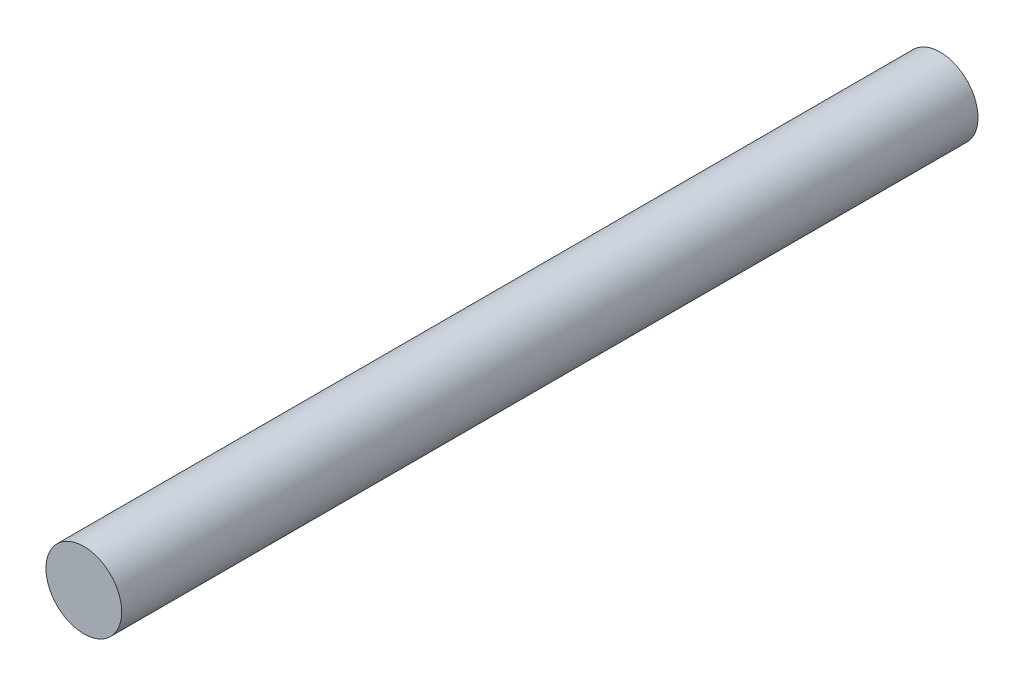
ISO-10303-21;
HEADER;
FILE_DESCRIPTION(('STEP AP214'),'2;1');
FILE_NAME('part.step','',(''),(''),'','','');
FILE_SCHEMA(('AUTOMOTIVE_DESIGN { 1 0 10303 214 1 1 1 1 }'));
ENDSEC;
DATA;
#1=APPLICATION_CONTEXT('core data for automotive mechanical design processes');
#2=APPLICATION_PROTOCOL_DEFINITION('international standard','automotive_design',2000,#1);
#3=PRODUCT_CONTEXT('',#1,'mechanical');
#4=PRODUCT('Part','Part','',(#3));
#5=PRODUCT_RELATED_PRODUCT_CATEGORY('part','',(#4));
#6=PRODUCT_DEFINITION_FORMATION('','',#4);
#7=PRODUCT_DEFINITION_CONTEXT('part definition',#1,'design');
#8=PRODUCT_DEFINITION('design','',#6,#7);
#9=PRODUCT_DEFINITION_SHAPE('','',#8);
#10=(LENGTH_UNIT() NAMED_UNIT(*) SI_UNIT(.MILLI.,.METRE.));
#11=(NAMED_UNIT(*) PLANE_ANGLE_UNIT() SI_UNIT($,.RADIAN.));
#12=(NAMED_UNIT(*) SI_UNIT($,.STERADIAN.) SOLID_ANGLE_UNIT());
#13=UNCERTAINTY_MEASURE_WITH_UNIT(LENGTH_MEASURE(1.E-05),#10,'distance_accuracy_value','');
#14=(GEOMETRIC_REPRESENTATION_CONTEXT(3) GLOBAL_UNCERTAINTY_ASSIGNED_CONTEXT((#13)) GLOBAL_UNIT_ASSIGNED_CONTEXT((#10,
#11,#12)) REPRESENTATION_CONTEXT('',''));
#15=CARTESIAN_POINT('',(0.,0.,0.));
#16=DIRECTION('',(0.,0.,1.));
#17=DIRECTION('',(1.,0.,0.));
#18=AXIS2_PLACEMENT_3D('',#15,#16,#17);
#19=CARTESIAN_POINT('',(0.,0.,71.7296));
#20=DIRECTION('',(0.,0.,-1.));
#21=DIRECTION('',(-1.,0.,0.));
#22=AXIS2_PLACEMENT_3D('',#19,#20,#21);
#23=CYLINDRICAL_SURFACE('',#22,3.175);
#24=CARTESIAN_POINT('',(0.,0.,71.7296));
#25=DIRECTION('',(0.,0.,1.));
#26=DIRECTION('',(1.,0.,0.));
#27=AXIS2_PLACEMENT_3D('',#24,#25,#26);
#28=CIRCLE('',#27,3.175);
#29=CARTESIAN_POINT('',(3.175,0.,71.7296));
#30=VERTEX_POINT('',#29);
#31=EDGE_CURVE('E10',#30,#30,#28,.T.);
#32=ORIENTED_EDGE('',*,*,#31,.F.);
#33=EDGE_LOOP('',(#32));
#34=FACE_BOUND('',#33,.T.);
#35=CARTESIAN_POINT('',(0.,0.,0.));
#36=DIRECTION('',(0.,0.,1.));
#37=DIRECTION('',(1.,0.,0.));
#38=AXIS2_PLACEMENT_3D('',#35,#36,#37);
#39=CIRCLE('',#38,3.175);
#40=CARTESIAN_POINT('',(3.175,0.,0.));
#41=VERTEX_POINT('',#40);
#42=EDGE_CURVE('E36',#41,#41,#39,.T.);
#43=ORIENTED_EDGE('',*,*,#42,.T.);
#44=EDGE_LOOP('',(#43));
#45=FACE_BOUND('',#44,.T.);
#46=ADVANCED_FACE('F33',(#34,#45),#23,.T.);
#47=CARTESIAN_POINT('',(0.,0.,71.7296));
#48=DIRECTION('',(0.,0.,1.));
#49=DIRECTION('',(1.,0.,0.));
#50=AXIS2_PLACEMENT_3D('',#47,#48,#49);
#51=PLANE('',#50);
#52=ORIENTED_EDGE('',*,*,#31,.T.);
#53=EDGE_LOOP('',(#52));
#54=FACE_BOUND('',#53,.T.);
#55=ADVANCED_FACE('F48',(#54),#51,.T.);
#56=CARTESIAN_POINT('',(0.,0.,0.));
#57=DIRECTION('',(0.,0.,1.));
#58=DIRECTION('',(1.,0.,0.));
#59=AXIS2_PLACEMENT_3D('',#56,#57,#58);
#60=PLANE('',#59);
#61=ORIENTED_EDGE('',*,*,#42,.F.);
#62=EDGE_LOOP('',(#61));
#63=FACE_BOUND('',#62,.T.);
#64=ADVANCED_FACE('F46',(#63),#60,.F.);
#65=CLOSED_SHELL('',(#46,#55,#64));
#66=MANIFOLD_SOLID_BREP('B2',#65);
#67=ADVANCED_BREP_SHAPE_REPRESENTATION('',(#18,#66),#14);
#68=SHAPE_DEFINITION_REPRESENTATION(#9,#67);
ENDSEC;
END-ISO-10303-21;
